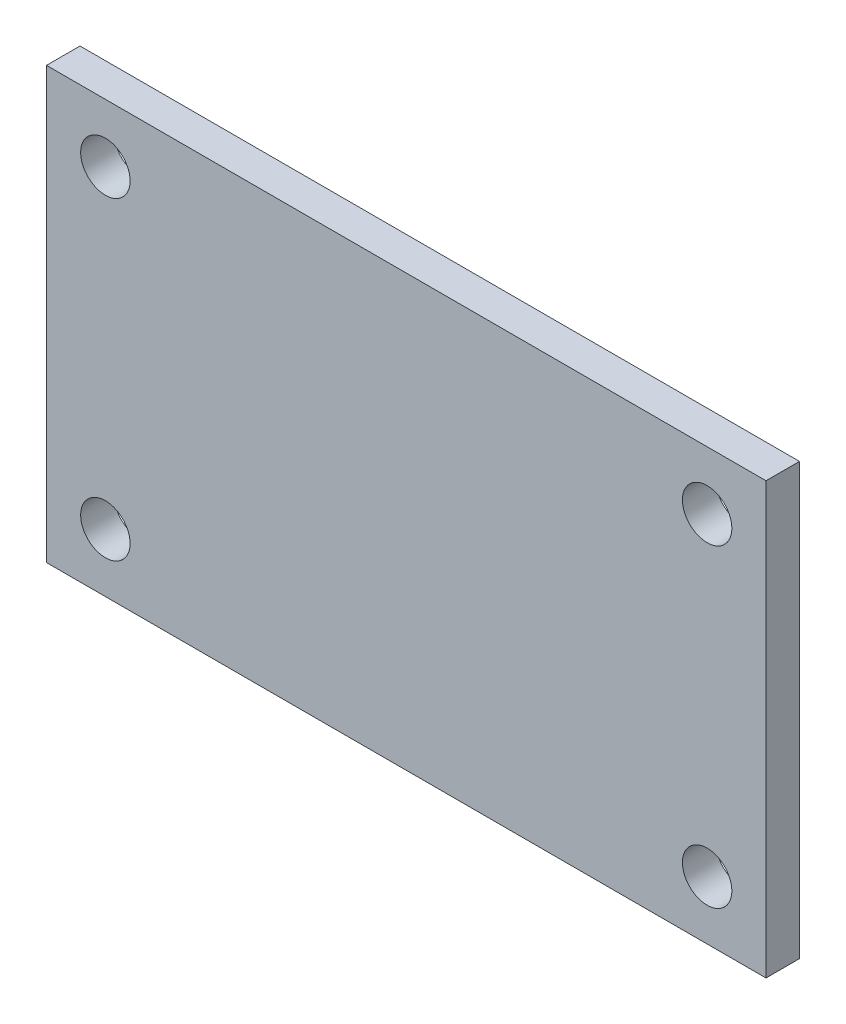
ISO-10303-21;
HEADER;
FILE_DESCRIPTION(('STEP AP214'),'2;1');
FILE_NAME('part.step','',(''),(''),'','','');
FILE_SCHEMA(('AUTOMOTIVE_DESIGN { 1 0 10303 214 1 1 1 1 }'));
ENDSEC;
DATA;
#1=APPLICATION_CONTEXT('core data for automotive mechanical design processes');
#2=APPLICATION_PROTOCOL_DEFINITION('international standard','automotive_design',2000,#1);
#3=PRODUCT_CONTEXT('',#1,'mechanical');
#4=PRODUCT('Part','Part','',(#3));
#5=PRODUCT_RELATED_PRODUCT_CATEGORY('part','',(#4));
#6=PRODUCT_DEFINITION_FORMATION('','',#4);
#7=PRODUCT_DEFINITION_CONTEXT('part definition',#1,'design');
#8=PRODUCT_DEFINITION('design','',#6,#7);
#9=PRODUCT_DEFINITION_SHAPE('','',#8);
#10=(LENGTH_UNIT() NAMED_UNIT(*) SI_UNIT(.MILLI.,.METRE.));
#11=(NAMED_UNIT(*) PLANE_ANGLE_UNIT() SI_UNIT($,.RADIAN.));
#12=(NAMED_UNIT(*) SI_UNIT($,.STERADIAN.) SOLID_ANGLE_UNIT());
#13=UNCERTAINTY_MEASURE_WITH_UNIT(LENGTH_MEASURE(1.E-05),#10,'distance_accuracy_value','');
#14=(GEOMETRIC_REPRESENTATION_CONTEXT(3) GLOBAL_UNCERTAINTY_ASSIGNED_CONTEXT((#13)) GLOBAL_UNIT_ASSIGNED_CONTEXT((#10,
#11,#12)) REPRESENTATION_CONTEXT('',''));
#15=CARTESIAN_POINT('',(0.,0.,0.));
#16=DIRECTION('',(0.,0.,1.));
#17=DIRECTION('',(1.,0.,0.));
#18=AXIS2_PLACEMENT_3D('',#15,#16,#17);
#19=CARTESIAN_POINT('',(17.4625,10.4521,0.8128));
#20=DIRECTION('',(-1.,0.,0.));
#21=DIRECTION('',(0.,-1.,0.));
#22=AXIS2_PLACEMENT_3D('',#19,#20,#21);
#23=PLANE('',#22);
#24=DIRECTION('',(0.,1.,0.));
#25=VECTOR('',#24,1.);
#26=CARTESIAN_POINT('',(17.4625,10.4521,-0.8128));
#27=LINE('',#26,#25);
#28=CARTESIAN_POINT('',(17.4625,-10.4521,-0.8128));
#29=VERTEX_POINT('',#28);
#30=CARTESIAN_POINT('',(17.4625,10.4521,-0.8128));
#31=VERTEX_POINT('',#30);
#32=EDGE_CURVE('E103',#29,#31,#27,.T.);
#33=ORIENTED_EDGE('',*,*,#32,.T.);
#34=DIRECTION('',(0.,0.,-1.));
#35=VECTOR('',#34,1.);
#36=CARTESIAN_POINT('',(17.4625,10.4521,0.8128));
#37=LINE('',#36,#35);
#38=CARTESIAN_POINT('',(17.4625,10.4521,0.8128));
#39=VERTEX_POINT('',#38);
#40=EDGE_CURVE('E11',#39,#31,#37,.T.);
#41=ORIENTED_EDGE('',*,*,#40,.F.);
#42=DIRECTION('',(0.,1.,0.));
#43=VECTOR('',#42,1.);
#44=CARTESIAN_POINT('',(17.4625,10.4521,0.8128));
#45=LINE('',#44,#43);
#46=CARTESIAN_POINT('',(17.4625,-10.4521,0.8128));
#47=VERTEX_POINT('',#46);
#48=EDGE_CURVE('E91',#47,#39,#45,.T.);
#49=ORIENTED_EDGE('',*,*,#48,.F.);
#50=DIRECTION('',(0.,0.,-1.));
#51=VECTOR('',#50,1.);
#52=CARTESIAN_POINT('',(17.4625,-10.4521,0.8128));
#53=LINE('',#52,#51);
#54=EDGE_CURVE('E99',#47,#29,#53,.T.);
#55=ORIENTED_EDGE('',*,*,#54,.T.);
#56=EDGE_LOOP('',(#33,#41,#49,#55));
#57=FACE_BOUND('',#56,.T.);
#58=ADVANCED_FACE('F40',(#57),#23,.F.);
#59=CARTESIAN_POINT('',(-17.4625,10.4521,0.8128));
#60=DIRECTION('',(0.,-1.,0.));
#61=DIRECTION('',(0.,0.,-1.));
#62=AXIS2_PLACEMENT_3D('',#59,#60,#61);
#63=PLANE('',#62);
#64=DIRECTION('',(-1.,0.,0.));
#65=VECTOR('',#64,1.);
#66=CARTESIAN_POINT('',(-17.4625,10.4521,-0.8128));
#67=LINE('',#66,#65);
#68=CARTESIAN_POINT('',(-17.4625,10.4521,-0.8128));
#69=VERTEX_POINT('',#68);
#70=EDGE_CURVE('E95',#31,#69,#67,.T.);
#71=ORIENTED_EDGE('',*,*,#70,.T.);
#72=DIRECTION('',(0.,0.,-1.));
#73=VECTOR('',#72,1.);
#74=CARTESIAN_POINT('',(-17.4625,10.4521,0.8128));
#75=LINE('',#74,#73);
#76=CARTESIAN_POINT('',(-17.4625,10.4521,0.8128));
#77=VERTEX_POINT('',#76);
#78=EDGE_CURVE('E48',#77,#69,#75,.T.);
#79=ORIENTED_EDGE('',*,*,#78,.F.);
#80=DIRECTION('',(-1.,0.,0.));
#81=VECTOR('',#80,1.);
#82=CARTESIAN_POINT('',(-17.4625,10.4521,0.8128));
#83=LINE('',#82,#81);
#84=EDGE_CURVE('E86',#39,#77,#83,.T.);
#85=ORIENTED_EDGE('',*,*,#84,.F.);
#86=ORIENTED_EDGE('',*,*,#40,.T.);
#87=EDGE_LOOP('',(#71,#79,#85,#86));
#88=FACE_BOUND('',#87,.T.);
#89=ADVANCED_FACE('F94',(#88),#63,.F.);
#90=CARTESIAN_POINT('',(-17.4625,10.4521,0.8128));
#91=DIRECTION('',(1.,0.,0.));
#92=DIRECTION('',(0.,0.,-1.));
#93=AXIS2_PLACEMENT_3D('',#90,#91,#92);
#94=PLANE('',#93);
#95=DIRECTION('',(0.,-1.,0.));
#96=VECTOR('',#95,1.);
#97=CARTESIAN_POINT('',(-17.4625,10.4521,-0.8128));
#98=LINE('',#97,#96);
#99=CARTESIAN_POINT('',(-17.4625,-10.4521,-0.8128));
#100=VERTEX_POINT('',#99);
#101=EDGE_CURVE('E73',#69,#100,#98,.T.);
#102=ORIENTED_EDGE('',*,*,#101,.T.);
#103=DIRECTION('',(0.,0.,-1.));
#104=VECTOR('',#103,1.);
#105=CARTESIAN_POINT('',(-17.4625,-10.4521,0.8128));
#106=LINE('',#105,#104);
#107=CARTESIAN_POINT('',(-17.4625,-10.4521,0.8128));
#108=VERTEX_POINT('',#107);
#109=EDGE_CURVE('E96',#108,#100,#106,.T.);
#110=ORIENTED_EDGE('',*,*,#109,.F.);
#111=DIRECTION('',(0.,-1.,0.));
#112=VECTOR('',#111,1.);
#113=CARTESIAN_POINT('',(-17.4625,10.4521,0.8128));
#114=LINE('',#113,#112);
#115=EDGE_CURVE('E89',#77,#108,#114,.T.);
#116=ORIENTED_EDGE('',*,*,#115,.F.);
#117=ORIENTED_EDGE('',*,*,#78,.T.);
#118=EDGE_LOOP('',(#102,#110,#116,#117));
#119=FACE_BOUND('',#118,.T.);
#120=ADVANCED_FACE('F97',(#119),#94,.F.);
#121=CARTESIAN_POINT('',(-17.4625,-10.4521,0.8128));
#122=DIRECTION('',(0.,1.,0.));
#123=DIRECTION('',(0.,0.,1.));
#124=AXIS2_PLACEMENT_3D('',#121,#122,#123);
#125=PLANE('',#124);
#126=DIRECTION('',(1.,0.,0.));
#127=VECTOR('',#126,1.);
#128=CARTESIAN_POINT('',(-17.4625,-10.4521,-0.8128));
#129=LINE('',#128,#127);
#130=EDGE_CURVE('E79',#100,#29,#129,.T.);
#131=ORIENTED_EDGE('',*,*,#130,.T.);
#132=ORIENTED_EDGE('',*,*,#54,.F.);
#133=DIRECTION('',(1.,0.,0.));
#134=VECTOR('',#133,1.);
#135=CARTESIAN_POINT('',(-17.4625,-10.4521,0.8128));
#136=LINE('',#135,#134);
#137=EDGE_CURVE('E56',#108,#47,#136,.T.);
#138=ORIENTED_EDGE('',*,*,#137,.F.);
#139=ORIENTED_EDGE('',*,*,#109,.T.);
#140=EDGE_LOOP('',(#131,#132,#138,#139));
#141=FACE_BOUND('',#140,.T.);
#142=ADVANCED_FACE('F111',(#141),#125,.F.);
#143=CARTESIAN_POINT('',(0.,0.,0.8128));
#144=DIRECTION('',(0.,0.,1.));
#145=DIRECTION('',(1.,0.,0.));
#146=AXIS2_PLACEMENT_3D('',#143,#144,#145);
#147=PLANE('',#146);
#148=CARTESIAN_POINT('',(-14.605,7.62,0.812800000000001));
#149=DIRECTION('',(0.,0.,1.));
#150=DIRECTION('',(1.,0.,0.));
#151=AXIS2_PLACEMENT_3D('',#148,#149,#150);
#152=CIRCLE('',#151,1.19999999999999);
#153=CARTESIAN_POINT('',(-13.405,7.62,0.812800000000001));
#154=VERTEX_POINT('',#153);
#155=EDGE_CURVE('E137',#154,#154,#152,.T.);
#156=ORIENTED_EDGE('',*,*,#155,.F.);
#157=EDGE_LOOP('',(#156));
#158=FACE_BOUND('',#157,.T.);
#159=CARTESIAN_POINT('',(14.605,7.62,0.812800000000001));
#160=DIRECTION('',(0.,0.,1.));
#161=DIRECTION('',(1.,0.,0.));
#162=AXIS2_PLACEMENT_3D('',#159,#160,#161);
#163=CIRCLE('',#162,1.19999999999999);
#164=CARTESIAN_POINT('',(15.805,7.62,0.812800000000001));
#165=VERTEX_POINT('',#164);
#166=EDGE_CURVE('E131',#165,#165,#163,.T.);
#167=ORIENTED_EDGE('',*,*,#166,.F.);
#168=EDGE_LOOP('',(#167));
#169=FACE_BOUND('',#168,.T.);
#170=CARTESIAN_POINT('',(14.605,-7.62,0.812800000000001));
#171=DIRECTION('',(0.,0.,1.));
#172=DIRECTION('',(1.,0.,0.));
#173=AXIS2_PLACEMENT_3D('',#170,#171,#172);
#174=CIRCLE('',#173,1.19999999999999);
#175=CARTESIAN_POINT('',(15.805,-7.62,0.812800000000001));
#176=VERTEX_POINT('',#175);
#177=EDGE_CURVE('E125',#176,#176,#174,.T.);
#178=ORIENTED_EDGE('',*,*,#177,.F.);
#179=EDGE_LOOP('',(#178));
#180=FACE_BOUND('',#179,.T.);
#181=CARTESIAN_POINT('',(-14.605,-7.62,0.812800000000001));
#182=DIRECTION('',(0.,0.,1.));
#183=DIRECTION('',(1.,0.,0.));
#184=AXIS2_PLACEMENT_3D('',#181,#182,#183);
#185=CIRCLE('',#184,1.19999999999999);
#186=CARTESIAN_POINT('',(-13.405,-7.62,0.812800000000001));
#187=VERTEX_POINT('',#186);
#188=EDGE_CURVE('E119',#187,#187,#185,.T.);
#189=ORIENTED_EDGE('',*,*,#188,.F.);
#190=EDGE_LOOP('',(#189));
#191=FACE_BOUND('',#190,.T.);
#192=ORIENTED_EDGE('',*,*,#48,.T.);
#193=ORIENTED_EDGE('',*,*,#84,.T.);
#194=ORIENTED_EDGE('',*,*,#115,.T.);
#195=ORIENTED_EDGE('',*,*,#137,.T.);
#196=EDGE_LOOP('',(#192,#193,#194,#195));
#197=FACE_BOUND('',#196,.T.);
#198=ADVANCED_FACE('F87',(#158,#169,#180,#191,#197),#147,.T.);
#199=CARTESIAN_POINT('',(0.,0.,-0.8128));
#200=DIRECTION('',(0.,0.,1.));
#201=DIRECTION('',(1.,0.,0.));
#202=AXIS2_PLACEMENT_3D('',#199,#200,#201);
#203=PLANE('',#202);
#204=CARTESIAN_POINT('',(-14.605,7.62,-0.8128));
#205=DIRECTION('',(0.,0.,1.));
#206=DIRECTION('',(1.,0.,0.));
#207=AXIS2_PLACEMENT_3D('',#204,#205,#206);
#208=CIRCLE('',#207,1.19999999999999);
#209=CARTESIAN_POINT('',(-13.405,7.62,-0.8128));
#210=VERTEX_POINT('',#209);
#211=EDGE_CURVE('E134',#210,#210,#208,.T.);
#212=ORIENTED_EDGE('',*,*,#211,.T.);
#213=EDGE_LOOP('',(#212));
#214=FACE_BOUND('',#213,.T.);
#215=CARTESIAN_POINT('',(14.605,7.62,-0.8128));
#216=DIRECTION('',(0.,0.,1.));
#217=DIRECTION('',(1.,0.,0.));
#218=AXIS2_PLACEMENT_3D('',#215,#216,#217);
#219=CIRCLE('',#218,1.19999999999999);
#220=CARTESIAN_POINT('',(15.805,7.62,-0.8128));
#221=VERTEX_POINT('',#220);
#222=EDGE_CURVE('E128',#221,#221,#219,.T.);
#223=ORIENTED_EDGE('',*,*,#222,.T.);
#224=EDGE_LOOP('',(#223));
#225=FACE_BOUND('',#224,.T.);
#226=CARTESIAN_POINT('',(14.605,-7.62,-0.8128));
#227=DIRECTION('',(0.,0.,1.));
#228=DIRECTION('',(1.,0.,0.));
#229=AXIS2_PLACEMENT_3D('',#226,#227,#228);
#230=CIRCLE('',#229,1.19999999999999);
#231=CARTESIAN_POINT('',(15.805,-7.62,-0.8128));
#232=VERTEX_POINT('',#231);
#233=EDGE_CURVE('E122',#232,#232,#230,.T.);
#234=ORIENTED_EDGE('',*,*,#233,.T.);
#235=EDGE_LOOP('',(#234));
#236=FACE_BOUND('',#235,.T.);
#237=CARTESIAN_POINT('',(-14.605,-7.62,-0.8128));
#238=DIRECTION('',(0.,0.,1.));
#239=DIRECTION('',(1.,0.,0.));
#240=AXIS2_PLACEMENT_3D('',#237,#238,#239);
#241=CIRCLE('',#240,1.19999999999999);
#242=CARTESIAN_POINT('',(-13.405,-7.62,-0.8128));
#243=VERTEX_POINT('',#242);
#244=EDGE_CURVE('E106',#243,#243,#241,.T.);
#245=ORIENTED_EDGE('',*,*,#244,.T.);
#246=EDGE_LOOP('',(#245));
#247=FACE_BOUND('',#246,.T.);
#248=ORIENTED_EDGE('',*,*,#32,.F.);
#249=ORIENTED_EDGE('',*,*,#130,.F.);
#250=ORIENTED_EDGE('',*,*,#101,.F.);
#251=ORIENTED_EDGE('',*,*,#70,.F.);
#252=EDGE_LOOP('',(#248,#249,#250,#251));
#253=FACE_BOUND('',#252,.T.);
#254=ADVANCED_FACE('F114',(#214,#225,#236,#247,#253),#203,.F.);
#255=CARTESIAN_POINT('',(-14.605,-7.62,0.8128));
#256=DIRECTION('',(0.,0.,1.));
#257=DIRECTION('',(1.,0.,0.));
#258=AXIS2_PLACEMENT_3D('',#255,#256,#257);
#259=CYLINDRICAL_SURFACE('',#258,1.19999999999999);
#260=ORIENTED_EDGE('',*,*,#244,.F.);
#261=EDGE_LOOP('',(#260));
#262=FACE_BOUND('',#261,.T.);
#263=ORIENTED_EDGE('',*,*,#188,.T.);
#264=EDGE_LOOP('',(#263));
#265=FACE_BOUND('',#264,.T.);
#266=ADVANCED_FACE('F152',(#262,#265),#259,.F.);
#267=CARTESIAN_POINT('',(14.605,-7.62,0.8128));
#268=DIRECTION('',(0.,0.,1.));
#269=DIRECTION('',(1.,0.,0.));
#270=AXIS2_PLACEMENT_3D('',#267,#268,#269);
#271=CYLINDRICAL_SURFACE('',#270,1.19999999999999);
#272=ORIENTED_EDGE('',*,*,#233,.F.);
#273=EDGE_LOOP('',(#272));
#274=FACE_BOUND('',#273,.T.);
#275=ORIENTED_EDGE('',*,*,#177,.T.);
#276=EDGE_LOOP('',(#275));
#277=FACE_BOUND('',#276,.T.);
#278=ADVANCED_FACE('F154',(#274,#277),#271,.F.);
#279=CARTESIAN_POINT('',(14.605,7.62,0.8128));
#280=DIRECTION('',(0.,0.,1.));
#281=DIRECTION('',(1.,0.,0.));
#282=AXIS2_PLACEMENT_3D('',#279,#280,#281);
#283=CYLINDRICAL_SURFACE('',#282,1.19999999999999);
#284=ORIENTED_EDGE('',*,*,#222,.F.);
#285=EDGE_LOOP('',(#284));
#286=FACE_BOUND('',#285,.T.);
#287=ORIENTED_EDGE('',*,*,#166,.T.);
#288=EDGE_LOOP('',(#287));
#289=FACE_BOUND('',#288,.T.);
#290=ADVANCED_FACE('F161',(#286,#289),#283,.F.);
#291=CARTESIAN_POINT('',(-14.605,7.62,0.8128));
#292=DIRECTION('',(0.,0.,1.));
#293=DIRECTION('',(1.,0.,0.));
#294=AXIS2_PLACEMENT_3D('',#291,#292,#293);
#295=CYLINDRICAL_SURFACE('',#294,1.19999999999999);
#296=ORIENTED_EDGE('',*,*,#211,.F.);
#297=EDGE_LOOP('',(#296));
#298=FACE_BOUND('',#297,.T.);
#299=ORIENTED_EDGE('',*,*,#155,.T.);
#300=EDGE_LOOP('',(#299));
#301=FACE_BOUND('',#300,.T.);
#302=ADVANCED_FACE('F141',(#298,#301),#295,.F.);
#303=CLOSED_SHELL('',(#58,#89,#120,#142,#198,#254,#266,#278,#290,#302));
#304=MANIFOLD_SOLID_BREP('B2',#303);
#305=ADVANCED_BREP_SHAPE_REPRESENTATION('',(#18,#304),#14);
#306=SHAPE_DEFINITION_REPRESENTATION(#9,#305);
ENDSEC;
END-ISO-10303-21;
